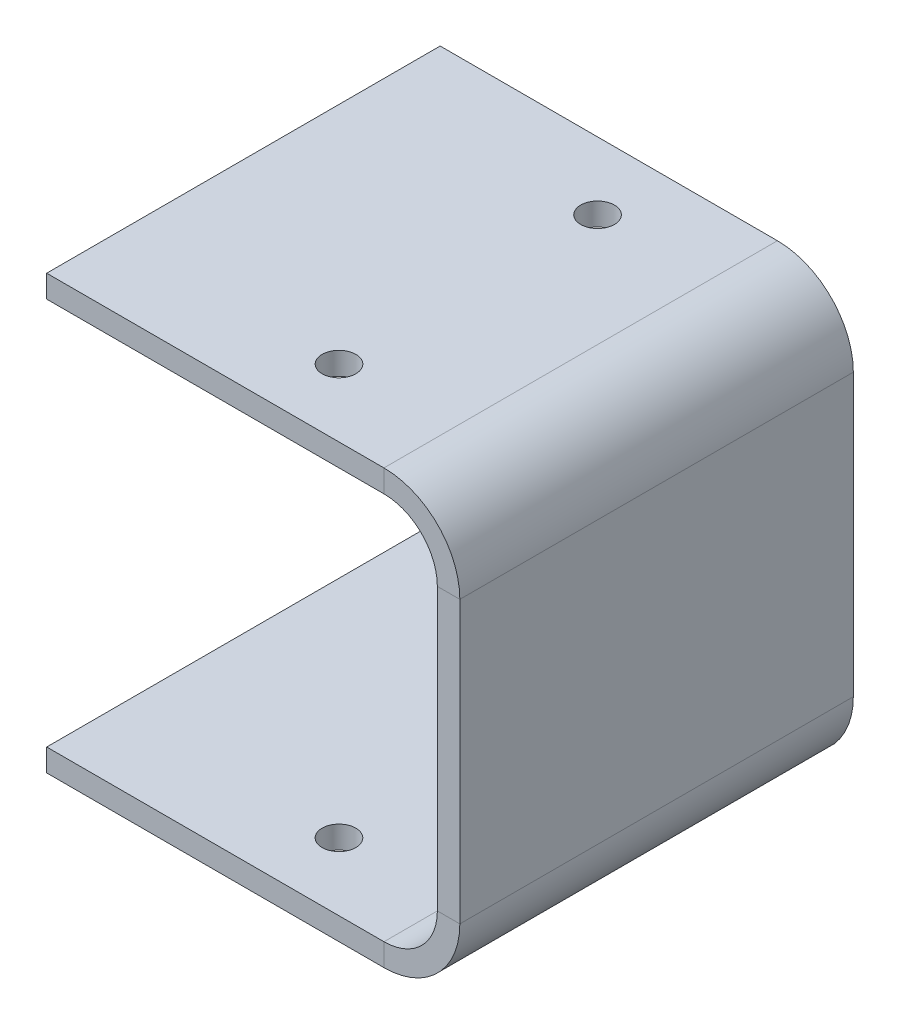
ISO-10303-21;
HEADER;
FILE_DESCRIPTION(('STEP AP214'),'2;1');
FILE_NAME('part.step','',(''),(''),'','','');
FILE_SCHEMA(('AUTOMOTIVE_DESIGN { 1 0 10303 214 1 1 1 1 }'));
ENDSEC;
DATA;
#1=APPLICATION_CONTEXT('core data for automotive mechanical design processes');
#2=APPLICATION_PROTOCOL_DEFINITION('international standard','automotive_design',2000,#1);
#3=PRODUCT_CONTEXT('',#1,'mechanical');
#4=PRODUCT('Part','Part','',(#3));
#5=PRODUCT_RELATED_PRODUCT_CATEGORY('part','',(#4));
#6=PRODUCT_DEFINITION_FORMATION('','',#4);
#7=PRODUCT_DEFINITION_CONTEXT('part definition',#1,'design');
#8=PRODUCT_DEFINITION('design','',#6,#7);
#9=PRODUCT_DEFINITION_SHAPE('','',#8);
#10=(LENGTH_UNIT() NAMED_UNIT(*) SI_UNIT(.MILLI.,.METRE.));
#11=(NAMED_UNIT(*) PLANE_ANGLE_UNIT() SI_UNIT($,.RADIAN.));
#12=(NAMED_UNIT(*) SI_UNIT($,.STERADIAN.) SOLID_ANGLE_UNIT());
#13=UNCERTAINTY_MEASURE_WITH_UNIT(LENGTH_MEASURE(1.E-05),#10,'distance_accuracy_value','');
#14=(GEOMETRIC_REPRESENTATION_CONTEXT(3) GLOBAL_UNCERTAINTY_ASSIGNED_CONTEXT((#13)) GLOBAL_UNIT_ASSIGNED_CONTEXT((#10,
#11,#12)) REPRESENTATION_CONTEXT('',''));
#15=CARTESIAN_POINT('',(0.,0.,0.));
#16=DIRECTION('',(0.,0.,1.));
#17=DIRECTION('',(1.,0.,0.));
#18=AXIS2_PLACEMENT_3D('',#15,#16,#17);
#19=CARTESIAN_POINT('',(29.9958939527827,31.7458939527828,0.));
#20=DIRECTION('',(0.,0.,-1.));
#21=DIRECTION('',(-1.,0.,0.));
#22=AXIS2_PLACEMENT_3D('',#19,#20,#21);
#23=PLANE('',#22);
#24=DIRECTION('',(1.,0.,0.));
#25=VECTOR('',#24,1.);
#26=CARTESIAN_POINT('',(36.7458939527828,31.7458939527828,0.));
#27=LINE('',#26,#25);
#28=CARTESIAN_POINT('',(34.7458939527828,31.7458939527828,0.));
#29=VERTEX_POINT('',#28);
#30=CARTESIAN_POINT('',(36.7458939527828,31.7458939527828,0.));
#31=VERTEX_POINT('',#30);
#32=EDGE_CURVE('E11',#29,#31,#27,.T.);
#33=ORIENTED_EDGE('',*,*,#32,.F.);
#34=CARTESIAN_POINT('',(29.9958939527827,31.7458939527828,0.));
#35=DIRECTION('',(0.,0.,-1.));
#36=DIRECTION('',(-1.,0.,0.));
#37=AXIS2_PLACEMENT_3D('',#34,#35,#36);
#38=CIRCLE('',#37,4.75000000000002);
#39=CARTESIAN_POINT('',(29.9958939527827,36.4958939527828,0.));
#40=VERTEX_POINT('',#39);
#41=EDGE_CURVE('E104',#29,#40,#38,.F.);
#42=ORIENTED_EDGE('',*,*,#41,.T.);
#43=DIRECTION('',(0.,1.,0.));
#44=VECTOR('',#43,1.);
#45=CARTESIAN_POINT('',(29.9958939527827,38.4958939527828,0.));
#46=LINE('',#45,#44);
#47=CARTESIAN_POINT('',(29.9958939527827,38.4958939527828,0.));
#48=VERTEX_POINT('',#47);
#49=EDGE_CURVE('E51',#40,#48,#46,.T.);
#50=ORIENTED_EDGE('',*,*,#49,.T.);
#51=CARTESIAN_POINT('',(29.9958939527827,31.7458939527828,0.));
#52=DIRECTION('',(0.,0.,1.));
#53=DIRECTION('',(1.,0.,0.));
#54=AXIS2_PLACEMENT_3D('',#51,#52,#53);
#55=CIRCLE('',#54,6.75000000000002);
#56=EDGE_CURVE('E107',#31,#48,#55,.T.);
#57=ORIENTED_EDGE('',*,*,#56,.F.);
#58=EDGE_LOOP('',(#33,#42,#50,#57));
#59=FACE_BOUND('',#58,.T.);
#60=ADVANCED_FACE('F40',(#59),#23,.T.);
#61=CARTESIAN_POINT('',(29.9958939527827,38.4958939527828,0.));
#62=DIRECTION('',(0.,0.,1.));
#63=DIRECTION('',(-1.,0.,0.));
#64=AXIS2_PLACEMENT_3D('',#61,#62,#63);
#65=PLANE('',#64);
#66=ORIENTED_EDGE('',*,*,#49,.F.);
#67=DIRECTION('',(1.,0.,0.));
#68=VECTOR('',#67,1.);
#69=CARTESIAN_POINT('',(29.9958939527827,36.4958939527828,0.));
#70=LINE('',#69,#68);
#71=CARTESIAN_POINT('',(-0.00410604721725466,36.4958939527828,0.));
#72=VERTEX_POINT('',#71);
#73=EDGE_CURVE('E221',#40,#72,#70,.F.);
#74=ORIENTED_EDGE('',*,*,#73,.T.);
#75=DIRECTION('',(0.,1.,0.));
#76=VECTOR('',#75,1.);
#77=CARTESIAN_POINT('',(-0.00410604721725466,38.4958939527828,0.));
#78=LINE('',#77,#76);
#79=CARTESIAN_POINT('',(-0.00410604721725466,38.4958939527828,0.));
#80=VERTEX_POINT('',#79);
#81=EDGE_CURVE('E179',#72,#80,#78,.T.);
#82=ORIENTED_EDGE('',*,*,#81,.T.);
#83=DIRECTION('',(-1.,0.,0.));
#84=VECTOR('',#83,1.);
#85=CARTESIAN_POINT('',(29.9958939527827,38.4958939527828,0.));
#86=LINE('',#85,#84);
#87=EDGE_CURVE('E222',#48,#80,#86,.T.);
#88=ORIENTED_EDGE('',*,*,#87,.F.);
#89=EDGE_LOOP('',(#66,#74,#82,#88));
#90=FACE_BOUND('',#89,.T.);
#91=ADVANCED_FACE('F318',(#90),#65,.F.);
#92=CARTESIAN_POINT('',(-0.00410604721725466,38.4958939527828,35.));
#93=DIRECTION('',(-1.,0.,0.));
#94=DIRECTION('',(0.,0.,-1.));
#95=AXIS2_PLACEMENT_3D('',#92,#93,#94);
#96=PLANE('',#95);
#97=ORIENTED_EDGE('',*,*,#81,.F.);
#98=DIRECTION('',(0.,0.,1.));
#99=VECTOR('',#98,1.);
#100=CARTESIAN_POINT('',(-0.00410604721725466,36.4958939527828,35.));
#101=LINE('',#100,#99);
#102=CARTESIAN_POINT('',(-0.00410604721725466,36.4958939527828,35.));
#103=VERTEX_POINT('',#102);
#104=EDGE_CURVE('E311',#103,#72,#101,.F.);
#105=ORIENTED_EDGE('',*,*,#104,.F.);
#106=DIRECTION('',(0.,1.,0.));
#107=VECTOR('',#106,1.);
#108=CARTESIAN_POINT('',(-0.00410604721725466,38.4958939527828,35.));
#109=LINE('',#108,#107);
#110=CARTESIAN_POINT('',(-0.00410604721725466,38.4958939527828,35.));
#111=VERTEX_POINT('',#110);
#112=EDGE_CURVE('E175',#103,#111,#109,.T.);
#113=ORIENTED_EDGE('',*,*,#112,.T.);
#114=DIRECTION('',(0.,0.,-1.));
#115=VECTOR('',#114,1.);
#116=CARTESIAN_POINT('',(-0.00410604721725466,38.4958939527828,35.));
#117=LINE('',#116,#115);
#118=EDGE_CURVE('E226',#111,#80,#117,.T.);
#119=ORIENTED_EDGE('',*,*,#118,.T.);
#120=EDGE_LOOP('',(#97,#105,#113,#119));
#121=FACE_BOUND('',#120,.T.);
#122=ADVANCED_FACE('F325',(#121),#96,.T.);
#123=CARTESIAN_POINT('',(29.9958939527827,38.4958939527828,35.));
#124=DIRECTION('',(0.,0.,1.));
#125=DIRECTION('',(-1.,0.,0.));
#126=AXIS2_PLACEMENT_3D('',#123,#124,#125);
#127=PLANE('',#126);
#128=ORIENTED_EDGE('',*,*,#112,.F.);
#129=DIRECTION('',(1.,0.,0.));
#130=VECTOR('',#129,1.);
#131=CARTESIAN_POINT('',(29.9958939527827,36.4958939527828,35.));
#132=LINE('',#131,#130);
#133=CARTESIAN_POINT('',(29.9958939527827,36.4958939527828,35.));
#134=VERTEX_POINT('',#133);
#135=EDGE_CURVE('E146',#134,#103,#132,.F.);
#136=ORIENTED_EDGE('',*,*,#135,.F.);
#137=DIRECTION('',(0.,1.,0.));
#138=VECTOR('',#137,1.);
#139=CARTESIAN_POINT('',(29.9958939527827,38.4958939527828,35.));
#140=LINE('',#139,#138);
#141=CARTESIAN_POINT('',(29.9958939527827,38.4958939527828,35.));
#142=VERTEX_POINT('',#141);
#143=EDGE_CURVE('E171',#134,#142,#140,.T.);
#144=ORIENTED_EDGE('',*,*,#143,.T.);
#145=DIRECTION('',(-1.,0.,0.));
#146=VECTOR('',#145,1.);
#147=CARTESIAN_POINT('',(29.9958939527827,38.4958939527828,35.));
#148=LINE('',#147,#146);
#149=EDGE_CURVE('E231',#142,#111,#148,.T.);
#150=ORIENTED_EDGE('',*,*,#149,.T.);
#151=EDGE_LOOP('',(#128,#136,#144,#150));
#152=FACE_BOUND('',#151,.T.);
#153=ADVANCED_FACE('F335',(#152),#127,.T.);
#154=CARTESIAN_POINT('',(29.9958939527827,31.7458939527828,35.));
#155=DIRECTION('',(0.,0.,-1.));
#156=DIRECTION('',(-1.,0.,0.));
#157=AXIS2_PLACEMENT_3D('',#154,#155,#156);
#158=PLANE('',#157);
#159=ORIENTED_EDGE('',*,*,#143,.F.);
#160=CARTESIAN_POINT('',(29.9958939527827,31.7458939527828,35.));
#161=DIRECTION('',(0.,0.,-1.));
#162=DIRECTION('',(-1.,0.,0.));
#163=AXIS2_PLACEMENT_3D('',#160,#161,#162);
#164=CIRCLE('',#163,4.75000000000002);
#165=CARTESIAN_POINT('',(34.7458939527828,31.7458939527828,35.));
#166=VERTEX_POINT('',#165);
#167=EDGE_CURVE('E135',#166,#134,#164,.F.);
#168=ORIENTED_EDGE('',*,*,#167,.F.);
#169=DIRECTION('',(1.,0.,0.));
#170=VECTOR('',#169,1.);
#171=CARTESIAN_POINT('',(36.7458939527828,31.7458939527828,35.));
#172=LINE('',#171,#170);
#173=CARTESIAN_POINT('',(36.7458939527828,31.7458939527828,35.));
#174=VERTEX_POINT('',#173);
#175=EDGE_CURVE('E167',#166,#174,#172,.T.);
#176=ORIENTED_EDGE('',*,*,#175,.T.);
#177=CARTESIAN_POINT('',(29.9958939527827,31.7458939527828,35.));
#178=DIRECTION('',(0.,0.,1.));
#179=DIRECTION('',(1.,0.,0.));
#180=AXIS2_PLACEMENT_3D('',#177,#178,#179);
#181=CIRCLE('',#180,6.75000000000002);
#182=EDGE_CURVE('E255',#174,#142,#181,.T.);
#183=ORIENTED_EDGE('',*,*,#182,.T.);
#184=EDGE_LOOP('',(#159,#168,#176,#183));
#185=FACE_BOUND('',#184,.T.);
#186=ADVANCED_FACE('F339',(#185),#158,.F.);
#187=CARTESIAN_POINT('',(36.7458939527828,6.74589395278275,35.));
#188=DIRECTION('',(0.,0.,1.));
#189=DIRECTION('',(0.,1.,0.));
#190=AXIS2_PLACEMENT_3D('',#187,#188,#189);
#191=PLANE('',#190);
#192=ORIENTED_EDGE('',*,*,#175,.F.);
#193=DIRECTION('',(0.,1.,0.));
#194=VECTOR('',#193,1.);
#195=CARTESIAN_POINT('',(34.7458939527828,6.74589395278275,35.));
#196=LINE('',#195,#194);
#197=CARTESIAN_POINT('',(34.7458939527828,6.74589395278275,35.));
#198=VERTEX_POINT('',#197);
#199=EDGE_CURVE('E123',#198,#166,#196,.T.);
#200=ORIENTED_EDGE('',*,*,#199,.F.);
#201=DIRECTION('',(1.,0.,0.));
#202=VECTOR('',#201,1.);
#203=CARTESIAN_POINT('',(36.7458939527828,6.74589395278275,35.));
#204=LINE('',#203,#202);
#205=CARTESIAN_POINT('',(36.7458939527828,6.74589395278275,35.));
#206=VERTEX_POINT('',#205);
#207=EDGE_CURVE('E163',#198,#206,#204,.T.);
#208=ORIENTED_EDGE('',*,*,#207,.T.);
#209=DIRECTION('',(0.,1.,0.));
#210=VECTOR('',#209,1.);
#211=CARTESIAN_POINT('',(36.7458939527828,6.74589395278275,35.));
#212=LINE('',#211,#210);
#213=EDGE_CURVE('E245',#206,#174,#212,.T.);
#214=ORIENTED_EDGE('',*,*,#213,.T.);
#215=EDGE_LOOP('',(#192,#200,#208,#214));
#216=FACE_BOUND('',#215,.T.);
#217=ADVANCED_FACE('F379',(#216),#191,.T.);
#218=CARTESIAN_POINT('',(30.,6.74589395278275,35.));
#219=DIRECTION('',(0.,0.,-1.));
#220=DIRECTION('',(-1.,0.,0.));
#221=AXIS2_PLACEMENT_3D('',#218,#219,#220);
#222=PLANE('',#221);
#223=ORIENTED_EDGE('',*,*,#207,.F.);
#224=CARTESIAN_POINT('',(30.,6.74589395278275,35.));
#225=DIRECTION('',(0.,0.,-1.));
#226=DIRECTION('',(-1.,0.,0.));
#227=AXIS2_PLACEMENT_3D('',#224,#225,#226);
#228=CIRCLE('',#227,4.74589395278275);
#229=CARTESIAN_POINT('',(30.,2.,35.));
#230=VERTEX_POINT('',#229);
#231=EDGE_CURVE('E227',#230,#198,#228,.F.);
#232=ORIENTED_EDGE('',*,*,#231,.F.);
#233=DIRECTION('',(0.,-1.,0.));
#234=VECTOR('',#233,1.);
#235=CARTESIAN_POINT('',(30.,0.,35.));
#236=LINE('',#235,#234);
#237=CARTESIAN_POINT('',(30.,0.,35.));
#238=VERTEX_POINT('',#237);
#239=EDGE_CURVE('E159',#230,#238,#236,.T.);
#240=ORIENTED_EDGE('',*,*,#239,.T.);
#241=CARTESIAN_POINT('',(30.,6.74589395278275,35.));
#242=DIRECTION('',(0.,0.,1.));
#243=DIRECTION('',(1.,0.,0.));
#244=AXIS2_PLACEMENT_3D('',#241,#242,#243);
#245=CIRCLE('',#244,6.74589395278275);
#246=EDGE_CURVE('E186',#238,#206,#245,.T.);
#247=ORIENTED_EDGE('',*,*,#246,.T.);
#248=EDGE_LOOP('',(#223,#232,#240,#247));
#249=FACE_BOUND('',#248,.T.);
#250=ADVANCED_FACE('F356',(#249),#222,.F.);
#251=CARTESIAN_POINT('',(0.,0.,35.));
#252=DIRECTION('',(0.,0.,1.));
#253=DIRECTION('',(1.,0.,0.));
#254=AXIS2_PLACEMENT_3D('',#251,#252,#253);
#255=PLANE('',#254);
#256=ORIENTED_EDGE('',*,*,#239,.F.);
#257=DIRECTION('',(1.,0.,0.));
#258=VECTOR('',#257,1.);
#259=CARTESIAN_POINT('',(0.,2.,35.));
#260=LINE('',#259,#258);
#261=CARTESIAN_POINT('',(0.,2.,35.));
#262=VERTEX_POINT('',#261);
#263=EDGE_CURVE('E286',#262,#230,#260,.T.);
#264=ORIENTED_EDGE('',*,*,#263,.F.);
#265=DIRECTION('',(0.,-1.,0.));
#266=VECTOR('',#265,1.);
#267=CARTESIAN_POINT('',(0.,0.,35.));
#268=LINE('',#267,#266);
#269=CARTESIAN_POINT('',(0.,0.,35.));
#270=VERTEX_POINT('',#269);
#271=EDGE_CURVE('E156',#262,#270,#268,.T.);
#272=ORIENTED_EDGE('',*,*,#271,.T.);
#273=DIRECTION('',(1.,0.,0.));
#274=VECTOR('',#273,1.);
#275=CARTESIAN_POINT('',(0.,0.,35.));
#276=LINE('',#275,#274);
#277=EDGE_CURVE('E267',#270,#238,#276,.T.);
#278=ORIENTED_EDGE('',*,*,#277,.T.);
#279=EDGE_LOOP('',(#256,#264,#272,#278));
#280=FACE_BOUND('',#279,.T.);
#281=ADVANCED_FACE('F363',(#280),#255,.T.);
#282=CARTESIAN_POINT('',(0.,0.,35.));
#283=DIRECTION('',(1.,0.,0.));
#284=DIRECTION('',(0.,0.,-1.));
#285=AXIS2_PLACEMENT_3D('',#282,#283,#284);
#286=PLANE('',#285);
#287=ORIENTED_EDGE('',*,*,#271,.F.);
#288=DIRECTION('',(0.,0.,1.));
#289=VECTOR('',#288,1.);
#290=CARTESIAN_POINT('',(0.,2.,35.));
#291=LINE('',#290,#289);
#292=CARTESIAN_POINT('',(0.,2.,0.));
#293=VERTEX_POINT('',#292);
#294=EDGE_CURVE('E292',#262,#293,#291,.F.);
#295=ORIENTED_EDGE('',*,*,#294,.T.);
#296=DIRECTION('',(0.,-1.,0.));
#297=VECTOR('',#296,1.);
#298=CARTESIAN_POINT('',(0.,0.,0.));
#299=LINE('',#298,#297);
#300=CARTESIAN_POINT('',(0.,0.,0.));
#301=VERTEX_POINT('',#300);
#302=EDGE_CURVE('E60',#293,#301,#299,.T.);
#303=ORIENTED_EDGE('',*,*,#302,.T.);
#304=DIRECTION('',(0.,0.,-1.));
#305=VECTOR('',#304,1.);
#306=CARTESIAN_POINT('',(0.,0.,35.));
#307=LINE('',#306,#305);
#308=EDGE_CURVE('E271',#270,#301,#307,.T.);
#309=ORIENTED_EDGE('',*,*,#308,.F.);
#310=EDGE_LOOP('',(#287,#295,#303,#309));
#311=FACE_BOUND('',#310,.T.);
#312=ADVANCED_FACE('F387',(#311),#286,.F.);
#313=CARTESIAN_POINT('',(0.,0.,0.));
#314=DIRECTION('',(0.,0.,1.));
#315=DIRECTION('',(1.,0.,0.));
#316=AXIS2_PLACEMENT_3D('',#313,#314,#315);
#317=PLANE('',#316);
#318=ORIENTED_EDGE('',*,*,#302,.F.);
#319=DIRECTION('',(1.,0.,0.));
#320=VECTOR('',#319,1.);
#321=CARTESIAN_POINT('',(0.,2.,0.));
#322=LINE('',#321,#320);
#323=CARTESIAN_POINT('',(30.,2.,0.));
#324=VERTEX_POINT('',#323);
#325=EDGE_CURVE('E287',#293,#324,#322,.T.);
#326=ORIENTED_EDGE('',*,*,#325,.T.);
#327=DIRECTION('',(0.,-1.,0.));
#328=VECTOR('',#327,1.);
#329=CARTESIAN_POINT('',(30.,0.,0.));
#330=LINE('',#329,#328);
#331=CARTESIAN_POINT('',(30.,0.,0.));
#332=VERTEX_POINT('',#331);
#333=EDGE_CURVE('E150',#324,#332,#330,.T.);
#334=ORIENTED_EDGE('',*,*,#333,.T.);
#335=DIRECTION('',(1.,0.,0.));
#336=VECTOR('',#335,1.);
#337=CARTESIAN_POINT('',(0.,0.,0.));
#338=LINE('',#337,#336);
#339=EDGE_CURVE('E259',#301,#332,#338,.T.);
#340=ORIENTED_EDGE('',*,*,#339,.F.);
#341=EDGE_LOOP('',(#318,#326,#334,#340));
#342=FACE_BOUND('',#341,.T.);
#343=ADVANCED_FACE('F389',(#342),#317,.F.);
#344=CARTESIAN_POINT('',(30.,6.74589395278275,0.));
#345=DIRECTION('',(0.,0.,-1.));
#346=DIRECTION('',(-1.,0.,0.));
#347=AXIS2_PLACEMENT_3D('',#344,#345,#346);
#348=PLANE('',#347);
#349=ORIENTED_EDGE('',*,*,#333,.F.);
#350=CARTESIAN_POINT('',(30.,6.74589395278275,0.));
#351=DIRECTION('',(0.,0.,-1.));
#352=DIRECTION('',(-1.,0.,0.));
#353=AXIS2_PLACEMENT_3D('',#350,#351,#352);
#354=CIRCLE('',#353,4.74589395278275);
#355=CARTESIAN_POINT('',(34.7458939527828,6.74589395278275,0.));
#356=VERTEX_POINT('',#355);
#357=EDGE_CURVE('E289',#324,#356,#354,.F.);
#358=ORIENTED_EDGE('',*,*,#357,.T.);
#359=DIRECTION('',(1.,0.,0.));
#360=VECTOR('',#359,1.);
#361=CARTESIAN_POINT('',(36.7458939527828,6.74589395278275,0.));
#362=LINE('',#361,#360);
#363=CARTESIAN_POINT('',(36.7458939527828,6.74589395278275,0.));
#364=VERTEX_POINT('',#363);
#365=EDGE_CURVE('E140',#356,#364,#362,.T.);
#366=ORIENTED_EDGE('',*,*,#365,.T.);
#367=CARTESIAN_POINT('',(30.,6.74589395278275,0.));
#368=DIRECTION('',(0.,0.,1.));
#369=DIRECTION('',(1.,0.,0.));
#370=AXIS2_PLACEMENT_3D('',#367,#368,#369);
#371=CIRCLE('',#370,6.74589395278275);
#372=EDGE_CURVE('E274',#332,#364,#371,.T.);
#373=ORIENTED_EDGE('',*,*,#372,.F.);
#374=EDGE_LOOP('',(#349,#358,#366,#373));
#375=FACE_BOUND('',#374,.T.);
#376=ADVANCED_FACE('F373',(#375),#348,.T.);
#377=CARTESIAN_POINT('',(36.7458939527828,6.74589395278275,0.));
#378=DIRECTION('',(0.,0.,1.));
#379=DIRECTION('',(0.,1.,0.));
#380=AXIS2_PLACEMENT_3D('',#377,#378,#379);
#381=PLANE('',#380);
#382=DIRECTION('',(0.,1.,0.));
#383=VECTOR('',#382,1.);
#384=CARTESIAN_POINT('',(34.7458939527828,6.74589395278275,0.));
#385=LINE('',#384,#383);
#386=EDGE_CURVE('E120',#356,#29,#385,.T.);
#387=ORIENTED_EDGE('',*,*,#386,.T.);
#388=ORIENTED_EDGE('',*,*,#32,.T.);
#389=DIRECTION('',(0.,1.,0.));
#390=VECTOR('',#389,1.);
#391=CARTESIAN_POINT('',(36.7458939527828,6.74589395278275,0.));
#392=LINE('',#391,#390);
#393=EDGE_CURVE('E239',#364,#31,#392,.T.);
#394=ORIENTED_EDGE('',*,*,#393,.F.);
#395=ORIENTED_EDGE('',*,*,#365,.F.);
#396=EDGE_LOOP('',(#387,#388,#394,#395));
#397=FACE_BOUND('',#396,.T.);
#398=ADVANCED_FACE('F42',(#397),#381,.F.);
#399=CARTESIAN_POINT('',(30.,6.74589395278275,35.));
#400=DIRECTION('',(0.,0.,-1.));
#401=DIRECTION('',(-1.,0.,0.));
#402=AXIS2_PLACEMENT_3D('',#399,#400,#401);
#403=CYLINDRICAL_SURFACE('',#402,6.74589395278275);
#404=ORIENTED_EDGE('',*,*,#372,.T.);
#405=DIRECTION('',(0.,0.,-1.));
#406=VECTOR('',#405,1.);
#407=CARTESIAN_POINT('',(36.7458939527828,6.74589395278275,35.));
#408=LINE('',#407,#406);
#409=EDGE_CURVE('E249',#206,#364,#408,.T.);
#410=ORIENTED_EDGE('',*,*,#409,.F.);
#411=ORIENTED_EDGE('',*,*,#246,.F.);
#412=DIRECTION('',(0.,0.,-1.));
#413=VECTOR('',#412,1.);
#414=CARTESIAN_POINT('',(30.,0.,35.));
#415=LINE('',#414,#413);
#416=EDGE_CURVE('E263',#238,#332,#415,.T.);
#417=ORIENTED_EDGE('',*,*,#416,.T.);
#418=EDGE_LOOP('',(#404,#410,#411,#417));
#419=FACE_BOUND('',#418,.T.);
#420=ADVANCED_FACE('F367',(#419),#403,.T.);
#421=CARTESIAN_POINT('',(0.,0.,35.));
#422=DIRECTION('',(0.,1.,0.));
#423=DIRECTION('',(0.,0.,1.));
#424=AXIS2_PLACEMENT_3D('',#421,#422,#423);
#425=PLANE('',#424);
#426=CARTESIAN_POINT('',(19.9958939527723,0.,28.9999999999997));
#427=DIRECTION('',(0.,-1.,0.));
#428=DIRECTION('',(1.,0.,0.));
#429=AXIS2_PLACEMENT_3D('',#426,#427,#428);
#430=CIRCLE('',#429,1.49999999999683);
#431=CARTESIAN_POINT('',(21.4958939527691,0.,28.9999999999997));
#432=VERTEX_POINT('',#431);
#433=EDGE_CURVE('E191',#432,#432,#430,.T.);
#434=ORIENTED_EDGE('',*,*,#433,.F.);
#435=EDGE_LOOP('',(#434));
#436=FACE_BOUND('',#435,.T.);
#437=CARTESIAN_POINT('',(19.9958939527723,0.,5.99999999999968));
#438=DIRECTION('',(0.,-1.,0.));
#439=DIRECTION('',(1.,0.,0.));
#440=AXIS2_PLACEMENT_3D('',#437,#438,#439);
#441=CIRCLE('',#440,1.49999999999683);
#442=CARTESIAN_POINT('',(21.4958939527691,0.,5.99999999999968));
#443=VERTEX_POINT('',#442);
#444=EDGE_CURVE('E201',#443,#443,#441,.T.);
#445=ORIENTED_EDGE('',*,*,#444,.F.);
#446=EDGE_LOOP('',(#445));
#447=FACE_BOUND('',#446,.T.);
#448=ORIENTED_EDGE('',*,*,#339,.T.);
#449=ORIENTED_EDGE('',*,*,#416,.F.);
#450=ORIENTED_EDGE('',*,*,#277,.F.);
#451=ORIENTED_EDGE('',*,*,#308,.T.);
#452=EDGE_LOOP('',(#448,#449,#450,#451));
#453=FACE_BOUND('',#452,.T.);
#454=ADVANCED_FACE('F368',(#436,#447,#453),#425,.F.);
#455=CARTESIAN_POINT('',(29.9958939527827,31.7458939527828,35.));
#456=DIRECTION('',(0.,0.,-1.));
#457=DIRECTION('',(-1.,0.,0.));
#458=AXIS2_PLACEMENT_3D('',#455,#456,#457);
#459=CYLINDRICAL_SURFACE('',#458,6.75000000000002);
#460=ORIENTED_EDGE('',*,*,#56,.T.);
#461=DIRECTION('',(0.,0.,-1.));
#462=VECTOR('',#461,1.);
#463=CARTESIAN_POINT('',(29.9958939527827,38.4958939527828,35.));
#464=LINE('',#463,#462);
#465=EDGE_CURVE('E235',#142,#48,#464,.T.);
#466=ORIENTED_EDGE('',*,*,#465,.F.);
#467=ORIENTED_EDGE('',*,*,#182,.F.);
#468=DIRECTION('',(0.,0.,-1.));
#469=VECTOR('',#468,1.);
#470=CARTESIAN_POINT('',(36.7458939527828,31.7458939527828,35.));
#471=LINE('',#470,#469);
#472=EDGE_CURVE('E242',#174,#31,#471,.T.);
#473=ORIENTED_EDGE('',*,*,#472,.T.);
#474=EDGE_LOOP('',(#460,#466,#467,#473));
#475=FACE_BOUND('',#474,.T.);
#476=ADVANCED_FACE('F344',(#475),#459,.T.);
#477=CARTESIAN_POINT('',(36.7458939527828,6.74589395278275,35.));
#478=DIRECTION('',(-1.,0.,0.));
#479=DIRECTION('',(0.,0.,1.));
#480=AXIS2_PLACEMENT_3D('',#477,#478,#479);
#481=PLANE('',#480);
#482=ORIENTED_EDGE('',*,*,#393,.T.);
#483=ORIENTED_EDGE('',*,*,#472,.F.);
#484=ORIENTED_EDGE('',*,*,#213,.F.);
#485=ORIENTED_EDGE('',*,*,#409,.T.);
#486=EDGE_LOOP('',(#482,#483,#484,#485));
#487=FACE_BOUND('',#486,.T.);
#488=ADVANCED_FACE('F377',(#487),#481,.F.);
#489=CARTESIAN_POINT('',(29.9958939527827,38.4958939527828,35.));
#490=DIRECTION('',(0.,-1.,0.));
#491=DIRECTION('',(1.,0.,0.));
#492=AXIS2_PLACEMENT_3D('',#489,#490,#491);
#493=PLANE('',#492);
#494=CARTESIAN_POINT('',(19.9958939527722,38.4958939527828,28.9999999999997));
#495=DIRECTION('',(0.,-1.,0.));
#496=DIRECTION('',(1.,0.,0.));
#497=AXIS2_PLACEMENT_3D('',#494,#495,#496);
#498=CIRCLE('',#497,1.49999999999683);
#499=CARTESIAN_POINT('',(21.4958939527691,38.4958939527828,28.9999999999997));
#500=VERTEX_POINT('',#499);
#501=EDGE_CURVE('E217',#500,#500,#498,.F.);
#502=ORIENTED_EDGE('',*,*,#501,.F.);
#503=EDGE_LOOP('',(#502));
#504=FACE_BOUND('',#503,.T.);
#505=CARTESIAN_POINT('',(19.9958939527722,38.4958939527828,5.99999999999968));
#506=DIRECTION('',(0.,-1.,0.));
#507=DIRECTION('',(1.,0.,0.));
#508=AXIS2_PLACEMENT_3D('',#505,#506,#507);
#509=CIRCLE('',#508,1.49999999999683);
#510=CARTESIAN_POINT('',(21.4958939527691,38.4958939527828,5.99999999999968));
#511=VERTEX_POINT('',#510);
#512=EDGE_CURVE('E198',#511,#511,#509,.F.);
#513=ORIENTED_EDGE('',*,*,#512,.F.);
#514=EDGE_LOOP('',(#513));
#515=FACE_BOUND('',#514,.T.);
#516=ORIENTED_EDGE('',*,*,#87,.T.);
#517=ORIENTED_EDGE('',*,*,#118,.F.);
#518=ORIENTED_EDGE('',*,*,#149,.F.);
#519=ORIENTED_EDGE('',*,*,#465,.T.);
#520=EDGE_LOOP('',(#516,#517,#518,#519));
#521=FACE_BOUND('',#520,.T.);
#522=ADVANCED_FACE('F331',(#504,#515,#521),#493,.F.);
#523=CARTESIAN_POINT('',(30.,6.74589395278275,35.));
#524=DIRECTION('',(0.,0.,-1.));
#525=DIRECTION('',(-1.,0.,0.));
#526=AXIS2_PLACEMENT_3D('',#523,#524,#525);
#527=CYLINDRICAL_SURFACE('',#526,4.74589395278275);
#528=ORIENTED_EDGE('',*,*,#357,.F.);
#529=DIRECTION('',(0.,0.,-1.));
#530=VECTOR('',#529,1.);
#531=CARTESIAN_POINT('',(30.,2.,35.));
#532=LINE('',#531,#530);
#533=EDGE_CURVE('E283',#230,#324,#532,.T.);
#534=ORIENTED_EDGE('',*,*,#533,.F.);
#535=ORIENTED_EDGE('',*,*,#231,.T.);
#536=DIRECTION('',(0.,0.,1.));
#537=VECTOR('',#536,1.);
#538=CARTESIAN_POINT('',(34.7458939527828,6.74589395278275,35.));
#539=LINE('',#538,#537);
#540=EDGE_CURVE('E136',#198,#356,#539,.F.);
#541=ORIENTED_EDGE('',*,*,#540,.T.);
#542=EDGE_LOOP('',(#528,#534,#535,#541));
#543=FACE_BOUND('',#542,.T.);
#544=ADVANCED_FACE('F382',(#543),#527,.F.);
#545=CARTESIAN_POINT('',(0.,2.,35.));
#546=DIRECTION('',(0.,1.,0.));
#547=DIRECTION('',(0.,0.,1.));
#548=AXIS2_PLACEMENT_3D('',#545,#546,#547);
#549=PLANE('',#548);
#550=CARTESIAN_POINT('',(19.9958939527723,2.,28.9999999999997));
#551=DIRECTION('',(0.,1.,0.));
#552=DIRECTION('',(0.,0.,1.));
#553=AXIS2_PLACEMENT_3D('',#550,#551,#552);
#554=CIRCLE('',#553,1.49999999999683);
#555=CARTESIAN_POINT('',(19.9958939527723,2.,30.4999999999965));
#556=VERTEX_POINT('',#555);
#557=EDGE_CURVE('E213',#556,#556,#554,.F.);
#558=ORIENTED_EDGE('',*,*,#557,.T.);
#559=EDGE_LOOP('',(#558));
#560=FACE_BOUND('',#559,.T.);
#561=CARTESIAN_POINT('',(19.9958939527723,2.,5.99999999999968));
#562=DIRECTION('',(0.,1.,0.));
#563=DIRECTION('',(0.,0.,1.));
#564=AXIS2_PLACEMENT_3D('',#561,#562,#563);
#565=CIRCLE('',#564,1.49999999999683);
#566=CARTESIAN_POINT('',(19.9958939527723,2.,7.49999999999651));
#567=VERTEX_POINT('',#566);
#568=EDGE_CURVE('E190',#567,#567,#565,.F.);
#569=ORIENTED_EDGE('',*,*,#568,.T.);
#570=EDGE_LOOP('',(#569));
#571=FACE_BOUND('',#570,.T.);
#572=ORIENTED_EDGE('',*,*,#325,.F.);
#573=ORIENTED_EDGE('',*,*,#294,.F.);
#574=ORIENTED_EDGE('',*,*,#263,.T.);
#575=ORIENTED_EDGE('',*,*,#533,.T.);
#576=EDGE_LOOP('',(#572,#573,#574,#575));
#577=FACE_BOUND('',#576,.T.);
#578=ADVANCED_FACE('F386',(#560,#571,#577),#549,.T.);
#579=CARTESIAN_POINT('',(29.9958939527827,31.7458939527828,35.));
#580=DIRECTION('',(0.,0.,-1.));
#581=DIRECTION('',(-1.,0.,0.));
#582=AXIS2_PLACEMENT_3D('',#579,#580,#581);
#583=CYLINDRICAL_SURFACE('',#582,4.75000000000002);
#584=ORIENTED_EDGE('',*,*,#41,.F.);
#585=DIRECTION('',(0.,0.,-1.));
#586=VECTOR('',#585,1.);
#587=CARTESIAN_POINT('',(34.7458939527828,31.7458939527828,35.));
#588=LINE('',#587,#586);
#589=EDGE_CURVE('E117',#166,#29,#588,.T.);
#590=ORIENTED_EDGE('',*,*,#589,.F.);
#591=ORIENTED_EDGE('',*,*,#167,.T.);
#592=DIRECTION('',(0.,0.,1.));
#593=VECTOR('',#592,1.);
#594=CARTESIAN_POINT('',(29.9958939527827,36.4958939527828,35.));
#595=LINE('',#594,#593);
#596=EDGE_CURVE('E132',#134,#40,#595,.F.);
#597=ORIENTED_EDGE('',*,*,#596,.T.);
#598=EDGE_LOOP('',(#584,#590,#591,#597));
#599=FACE_BOUND('',#598,.T.);
#600=ADVANCED_FACE('F130',(#599),#583,.F.);
#601=CARTESIAN_POINT('',(34.7458939527828,6.74589395278275,35.));
#602=DIRECTION('',(-1.,0.,0.));
#603=DIRECTION('',(0.,0.,1.));
#604=AXIS2_PLACEMENT_3D('',#601,#602,#603);
#605=PLANE('',#604);
#606=ORIENTED_EDGE('',*,*,#386,.F.);
#607=ORIENTED_EDGE('',*,*,#540,.F.);
#608=ORIENTED_EDGE('',*,*,#199,.T.);
#609=ORIENTED_EDGE('',*,*,#589,.T.);
#610=EDGE_LOOP('',(#606,#607,#608,#609));
#611=FACE_BOUND('',#610,.T.);
#612=ADVANCED_FACE('F118',(#611),#605,.T.);
#613=CARTESIAN_POINT('',(29.9958939527827,36.4958939527828,35.));
#614=DIRECTION('',(0.,-1.,0.));
#615=DIRECTION('',(1.,0.,0.));
#616=AXIS2_PLACEMENT_3D('',#613,#614,#615);
#617=PLANE('',#616);
#618=CARTESIAN_POINT('',(19.9958939527722,36.4958939527828,28.9999999999997));
#619=DIRECTION('',(0.,-1.,0.));
#620=DIRECTION('',(1.,0.,0.));
#621=AXIS2_PLACEMENT_3D('',#618,#619,#620);
#622=CIRCLE('',#621,1.49999999999683);
#623=CARTESIAN_POINT('',(21.4958939527691,36.4958939527828,28.9999999999997));
#624=VERTEX_POINT('',#623);
#625=EDGE_CURVE('E44',#624,#624,#622,.F.);
#626=ORIENTED_EDGE('',*,*,#625,.T.);
#627=EDGE_LOOP('',(#626));
#628=FACE_BOUND('',#627,.T.);
#629=CARTESIAN_POINT('',(19.9958939527722,36.4958939527828,5.99999999999968));
#630=DIRECTION('',(0.,-1.,0.));
#631=DIRECTION('',(1.,0.,0.));
#632=AXIS2_PLACEMENT_3D('',#629,#630,#631);
#633=CIRCLE('',#632,1.49999999999683);
#634=CARTESIAN_POINT('',(21.4958939527691,36.4958939527828,5.99999999999968));
#635=VERTEX_POINT('',#634);
#636=EDGE_CURVE('E187',#635,#635,#633,.F.);
#637=ORIENTED_EDGE('',*,*,#636,.T.);
#638=EDGE_LOOP('',(#637));
#639=FACE_BOUND('',#638,.T.);
#640=ORIENTED_EDGE('',*,*,#73,.F.);
#641=ORIENTED_EDGE('',*,*,#596,.F.);
#642=ORIENTED_EDGE('',*,*,#135,.T.);
#643=ORIENTED_EDGE('',*,*,#104,.T.);
#644=EDGE_LOOP('',(#640,#641,#642,#643));
#645=FACE_BOUND('',#644,.T.);
#646=ADVANCED_FACE('F321',(#628,#639,#645),#617,.T.);
#647=CARTESIAN_POINT('',(19.9958939527723,0.,5.99999999999968));
#648=DIRECTION('',(0.,1.,0.));
#649=DIRECTION('',(-1.,0.,0.));
#650=AXIS2_PLACEMENT_3D('',#647,#648,#649);
#651=CYLINDRICAL_SURFACE('',#650,1.49999999999683);
#652=ORIENTED_EDGE('',*,*,#636,.F.);
#653=EDGE_LOOP('',(#652));
#654=FACE_BOUND('',#653,.T.);
#655=ORIENTED_EDGE('',*,*,#512,.T.);
#656=EDGE_LOOP('',(#655));
#657=FACE_BOUND('',#656,.T.);
#658=ADVANCED_FACE('F532',(#654,#657),#651,.F.);
#659=CARTESIAN_POINT('',(19.9958939527723,0.,28.9999999999997));
#660=DIRECTION('',(0.,1.,0.));
#661=DIRECTION('',(-1.,0.,0.));
#662=AXIS2_PLACEMENT_3D('',#659,#660,#661);
#663=CYLINDRICAL_SURFACE('',#662,1.49999999999683);
#664=ORIENTED_EDGE('',*,*,#625,.F.);
#665=EDGE_LOOP('',(#664));
#666=FACE_BOUND('',#665,.T.);
#667=ORIENTED_EDGE('',*,*,#501,.T.);
#668=EDGE_LOOP('',(#667));
#669=FACE_BOUND('',#668,.T.);
#670=ADVANCED_FACE('F542',(#666,#669),#663,.F.);
#671=ORIENTED_EDGE('',*,*,#568,.F.);
#672=EDGE_LOOP('',(#671));
#673=FACE_BOUND('',#672,.T.);
#674=ORIENTED_EDGE('',*,*,#444,.T.);
#675=EDGE_LOOP('',(#674));
#676=FACE_BOUND('',#675,.T.);
#677=ADVANCED_FACE('F545',(#673,#676),#651,.F.);
#678=ORIENTED_EDGE('',*,*,#557,.F.);
#679=EDGE_LOOP('',(#678));
#680=FACE_BOUND('',#679,.T.);
#681=ORIENTED_EDGE('',*,*,#433,.T.);
#682=EDGE_LOOP('',(#681));
#683=FACE_BOUND('',#682,.T.);
#684=ADVANCED_FACE('F555',(#680,#683),#663,.F.);
#685=CLOSED_SHELL('',(#60,#91,#122,#153,#186,#217,#250,#281,#312,#343,#376,#398,#420,#454,#476,
#488,#522,#544,#578,#600,#612,#646,#658,#670,#677,#684));
#686=MANIFOLD_SOLID_BREP('B2',#685);
#687=ADVANCED_BREP_SHAPE_REPRESENTATION('',(#18,#686),#14);
#688=SHAPE_DEFINITION_REPRESENTATION(#9,#687);
ENDSEC;
END-ISO-10303-21;
